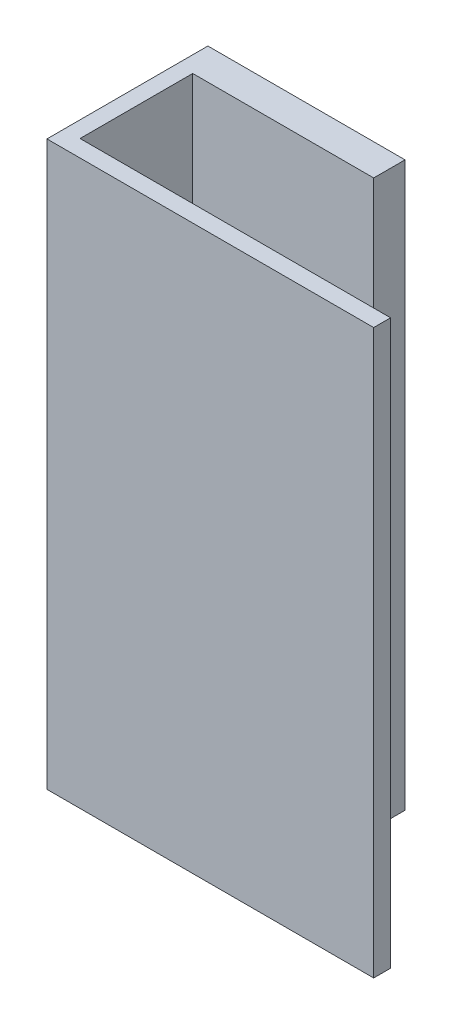
ISO-10303-21;
HEADER;
FILE_DESCRIPTION(('STEP AP214'),'2;1');
FILE_NAME('part.step','',(''),(''),'','','');
FILE_SCHEMA(('AUTOMOTIVE_DESIGN { 1 0 10303 214 1 1 1 1 }'));
ENDSEC;
DATA;
#1=APPLICATION_CONTEXT('core data for automotive mechanical design processes');
#2=APPLICATION_PROTOCOL_DEFINITION('international standard','automotive_design',2000,#1);
#3=PRODUCT_CONTEXT('',#1,'mechanical');
#4=PRODUCT('Part','Part','',(#3));
#5=PRODUCT_RELATED_PRODUCT_CATEGORY('part','',(#4));
#6=PRODUCT_DEFINITION_FORMATION('','',#4);
#7=PRODUCT_DEFINITION_CONTEXT('part definition',#1,'design');
#8=PRODUCT_DEFINITION('design','',#6,#7);
#9=PRODUCT_DEFINITION_SHAPE('','',#8);
#10=(LENGTH_UNIT() NAMED_UNIT(*) SI_UNIT(.MILLI.,.METRE.));
#11=(NAMED_UNIT(*) PLANE_ANGLE_UNIT() SI_UNIT($,.RADIAN.));
#12=(NAMED_UNIT(*) SI_UNIT($,.STERADIAN.) SOLID_ANGLE_UNIT());
#13=UNCERTAINTY_MEASURE_WITH_UNIT(LENGTH_MEASURE(1.E-05),#10,'distance_accuracy_value','');
#14=(GEOMETRIC_REPRESENTATION_CONTEXT(3) GLOBAL_UNCERTAINTY_ASSIGNED_CONTEXT((#13)) GLOBAL_UNIT_ASSIGNED_CONTEXT((#10,
#11,#12)) REPRESENTATION_CONTEXT('',''));
#15=CARTESIAN_POINT('',(0.,0.,0.));
#16=DIRECTION('',(0.,0.,1.));
#17=DIRECTION('',(1.,0.,0.));
#18=AXIS2_PLACEMENT_3D('',#15,#16,#17);
#19=CARTESIAN_POINT('',(0.,25.,0.));
#20=DIRECTION('',(0.,0.,-1.));
#21=DIRECTION('',(-1.,0.,0.));
#22=AXIS2_PLACEMENT_3D('',#19,#20,#21);
#23=PLANE('',#22);
#24=DIRECTION('',(0.,-1.,0.));
#25=VECTOR('',#24,1.);
#26=CARTESIAN_POINT('',(0.,25.,0.));
#27=LINE('',#26,#25);
#28=CARTESIAN_POINT('',(0.,145.,0.));
#29=VERTEX_POINT('',#28);
#30=CARTESIAN_POINT('',(0.,45.,0.));
#31=VERTEX_POINT('',#30);
#32=EDGE_CURVE('E11',#29,#31,#27,.T.);
#33=ORIENTED_EDGE('',*,*,#32,.T.);
#34=DIRECTION('',(1.,0.,0.));
#35=VECTOR('',#34,1.);
#36=CARTESIAN_POINT('',(0.,45.,0.));
#37=LINE('',#36,#35);
#38=CARTESIAN_POINT('',(58.,45.,0.));
#39=VERTEX_POINT('',#38);
#40=EDGE_CURVE('E125',#31,#39,#37,.T.);
#41=ORIENTED_EDGE('',*,*,#40,.T.);
#42=DIRECTION('',(0.,-1.,0.));
#43=VECTOR('',#42,1.);
#44=CARTESIAN_POINT('',(58.,145.,0.));
#45=LINE('',#44,#43);
#46=CARTESIAN_POINT('',(58.,145.,0.));
#47=VERTEX_POINT('',#46);
#48=EDGE_CURVE('E147',#47,#39,#45,.T.);
#49=ORIENTED_EDGE('',*,*,#48,.F.);
#50=DIRECTION('',(1.,0.,0.));
#51=VECTOR('',#50,1.);
#52=CARTESIAN_POINT('',(0.,145.,0.));
#53=LINE('',#52,#51);
#54=EDGE_CURVE('E161',#29,#47,#53,.T.);
#55=ORIENTED_EDGE('',*,*,#54,.F.);
#56=EDGE_LOOP('',(#33,#41,#49,#55));
#57=FACE_BOUND('',#56,.T.);
#58=ADVANCED_FACE('F43',(#57),#23,.F.);
#59=CARTESIAN_POINT('',(0.,25.,0.));
#60=DIRECTION('',(1.,0.,0.));
#61=DIRECTION('',(0.,0.,-1.));
#62=AXIS2_PLACEMENT_3D('',#59,#60,#61);
#63=PLANE('',#62);
#64=DIRECTION('',(0.,-1.,0.));
#65=VECTOR('',#64,1.);
#66=CARTESIAN_POINT('',(0.,145.,-28.5668374998999));
#67=LINE('',#66,#65);
#68=CARTESIAN_POINT('',(0.,145.,-28.5668374998999));
#69=VERTEX_POINT('',#68);
#70=CARTESIAN_POINT('',(0.,45.,-28.5668374998999));
#71=VERTEX_POINT('',#70);
#72=EDGE_CURVE('E59',#69,#71,#67,.T.);
#73=ORIENTED_EDGE('',*,*,#72,.T.);
#74=DIRECTION('',(0.,0.,1.));
#75=VECTOR('',#74,1.);
#76=CARTESIAN_POINT('',(0.,45.,0.));
#77=LINE('',#76,#75);
#78=EDGE_CURVE('E117',#71,#31,#77,.T.);
#79=ORIENTED_EDGE('',*,*,#78,.T.);
#80=ORIENTED_EDGE('',*,*,#32,.F.);
#81=DIRECTION('',(0.,0.,1.));
#82=VECTOR('',#81,1.);
#83=CARTESIAN_POINT('',(0.,145.,-28.5668374998999));
#84=LINE('',#83,#82);
#85=EDGE_CURVE('E119',#69,#29,#84,.T.);
#86=ORIENTED_EDGE('',*,*,#85,.F.);
#87=EDGE_LOOP('',(#73,#79,#80,#86));
#88=FACE_BOUND('',#87,.T.);
#89=ADVANCED_FACE('F45',(#88),#63,.F.);
#90=CARTESIAN_POINT('',(3.,45.,-3.));
#91=DIRECTION('',(0.,0.,-1.));
#92=DIRECTION('',(-1.,0.,0.));
#93=AXIS2_PLACEMENT_3D('',#90,#91,#92);
#94=PLANE('',#93);
#95=DIRECTION('',(0.,-1.,0.));
#96=VECTOR('',#95,1.);
#97=CARTESIAN_POINT('',(58.,145.,-3.));
#98=LINE('',#97,#96);
#99=CARTESIAN_POINT('',(58.,145.,-3.));
#100=VERTEX_POINT('',#99);
#101=CARTESIAN_POINT('',(58.,45.,-3.));
#102=VERTEX_POINT('',#101);
#103=EDGE_CURVE('E143',#100,#102,#98,.T.);
#104=ORIENTED_EDGE('',*,*,#103,.T.);
#105=DIRECTION('',(-1.,0.,0.));
#106=VECTOR('',#105,1.);
#107=CARTESIAN_POINT('',(58.,45.,-3.));
#108=LINE('',#107,#106);
#109=CARTESIAN_POINT('',(2.87608575347081,45.,-3.));
#110=VERTEX_POINT('',#109);
#111=EDGE_CURVE('E192',#102,#110,#108,.T.);
#112=ORIENTED_EDGE('',*,*,#111,.T.);
#113=DIRECTION('',(0.,-1.,0.));
#114=VECTOR('',#113,1.);
#115=CARTESIAN_POINT('',(2.87608575347081,145.,-3.));
#116=LINE('',#115,#114);
#117=CARTESIAN_POINT('',(2.87608575347081,145.,-3.));
#118=VERTEX_POINT('',#117);
#119=EDGE_CURVE('E136',#118,#110,#116,.T.);
#120=ORIENTED_EDGE('',*,*,#119,.F.);
#121=DIRECTION('',(-1.,0.,0.));
#122=VECTOR('',#121,1.);
#123=CARTESIAN_POINT('',(58.,145.,-3.));
#124=LINE('',#123,#122);
#125=EDGE_CURVE('E174',#100,#118,#124,.T.);
#126=ORIENTED_EDGE('',*,*,#125,.F.);
#127=EDGE_LOOP('',(#104,#112,#120,#126));
#128=FACE_BOUND('',#127,.T.);
#129=ADVANCED_FACE('F207',(#128),#94,.T.);
#130=CARTESIAN_POINT('',(32.,45.,-23.));
#131=DIRECTION('',(0.,0.,-1.));
#132=DIRECTION('',(-1.,0.,0.));
#133=AXIS2_PLACEMENT_3D('',#130,#131,#132);
#134=PLANE('',#133);
#135=DIRECTION('',(1.,0.,0.));
#136=VECTOR('',#135,1.);
#137=CARTESIAN_POINT('',(2.87608575347081,45.,-23.));
#138=LINE('',#137,#136);
#139=CARTESIAN_POINT('',(2.87608575347081,45.,-23.));
#140=VERTEX_POINT('',#139);
#141=CARTESIAN_POINT('',(35.,45.,-23.));
#142=VERTEX_POINT('',#141);
#143=EDGE_CURVE('E120',#140,#142,#138,.T.);
#144=ORIENTED_EDGE('',*,*,#143,.T.);
#145=DIRECTION('',(0.,-1.,0.));
#146=VECTOR('',#145,1.);
#147=CARTESIAN_POINT('',(35.,45.,-23.));
#148=LINE('',#147,#146);
#149=CARTESIAN_POINT('',(35.,145.,-23.));
#150=VERTEX_POINT('',#149);
#151=EDGE_CURVE('E52',#150,#142,#148,.T.);
#152=ORIENTED_EDGE('',*,*,#151,.F.);
#153=DIRECTION('',(1.,0.,0.));
#154=VECTOR('',#153,1.);
#155=CARTESIAN_POINT('',(2.87608575347081,145.,-23.));
#156=LINE('',#155,#154);
#157=CARTESIAN_POINT('',(2.87608575347081,145.,-23.));
#158=VERTEX_POINT('',#157);
#159=EDGE_CURVE('E181',#158,#150,#156,.T.);
#160=ORIENTED_EDGE('',*,*,#159,.F.);
#161=DIRECTION('',(0.,-1.,0.));
#162=VECTOR('',#161,1.);
#163=CARTESIAN_POINT('',(2.87608575347081,145.,-23.));
#164=LINE('',#163,#162);
#165=EDGE_CURVE('E131',#158,#140,#164,.T.);
#166=ORIENTED_EDGE('',*,*,#165,.T.);
#167=EDGE_LOOP('',(#144,#152,#160,#166));
#168=FACE_BOUND('',#167,.T.);
#169=ADVANCED_FACE('F201',(#168),#134,.F.);
#170=CARTESIAN_POINT('',(35.,45.,-23.));
#171=DIRECTION('',(-1.,0.,0.));
#172=DIRECTION('',(0.,0.,1.));
#173=AXIS2_PLACEMENT_3D('',#170,#171,#172);
#174=PLANE('',#173);
#175=ORIENTED_EDGE('',*,*,#151,.T.);
#176=DIRECTION('',(0.,0.,-1.));
#177=VECTOR('',#176,1.);
#178=CARTESIAN_POINT('',(35.,45.,-23.));
#179=LINE('',#178,#177);
#180=CARTESIAN_POINT('',(35.,45.,-28.5668374998999));
#181=VERTEX_POINT('',#180);
#182=EDGE_CURVE('E114',#142,#181,#179,.T.);
#183=ORIENTED_EDGE('',*,*,#182,.T.);
#184=DIRECTION('',(0.,-1.,0.));
#185=VECTOR('',#184,1.);
#186=CARTESIAN_POINT('',(35.,145.,-28.5668374998999));
#187=LINE('',#186,#185);
#188=CARTESIAN_POINT('',(35.,145.,-28.5668374998999));
#189=VERTEX_POINT('',#188);
#190=EDGE_CURVE('E67',#189,#181,#187,.T.);
#191=ORIENTED_EDGE('',*,*,#190,.F.);
#192=DIRECTION('',(0.,0.,1.));
#193=VECTOR('',#192,1.);
#194=CARTESIAN_POINT('',(35.,145.,-28.5668374998999));
#195=LINE('',#194,#193);
#196=EDGE_CURVE('E185',#189,#150,#195,.T.);
#197=ORIENTED_EDGE('',*,*,#196,.T.);
#198=EDGE_LOOP('',(#175,#183,#191,#197));
#199=FACE_BOUND('',#198,.T.);
#200=ADVANCED_FACE('F122',(#199),#174,.F.);
#201=CARTESIAN_POINT('',(0.,45.,0.));
#202=DIRECTION('',(0.,1.,0.));
#203=DIRECTION('',(0.,0.,1.));
#204=AXIS2_PLACEMENT_3D('',#201,#202,#203);
#205=PLANE('',#204);
#206=ORIENTED_EDGE('',*,*,#182,.F.);
#207=ORIENTED_EDGE('',*,*,#143,.F.);
#208=DIRECTION('',(0.,0.,1.));
#209=VECTOR('',#208,1.);
#210=CARTESIAN_POINT('',(2.87608575347081,45.,-23.));
#211=LINE('',#210,#209);
#212=EDGE_CURVE('E196',#140,#110,#211,.T.);
#213=ORIENTED_EDGE('',*,*,#212,.T.);
#214=ORIENTED_EDGE('',*,*,#111,.F.);
#215=DIRECTION('',(0.,0.,1.));
#216=VECTOR('',#215,1.);
#217=CARTESIAN_POINT('',(58.,45.,-3.));
#218=LINE('',#217,#216);
#219=EDGE_CURVE('E124',#102,#39,#218,.T.);
#220=ORIENTED_EDGE('',*,*,#219,.T.);
#221=ORIENTED_EDGE('',*,*,#40,.F.);
#222=ORIENTED_EDGE('',*,*,#78,.F.);
#223=DIRECTION('',(1.,0.,0.));
#224=VECTOR('',#223,1.);
#225=CARTESIAN_POINT('',(0.,45.,-28.5668374998999));
#226=LINE('',#225,#224);
#227=EDGE_CURVE('E112',#71,#181,#226,.T.);
#228=ORIENTED_EDGE('',*,*,#227,.T.);
#229=EDGE_LOOP('',(#206,#207,#213,#214,#220,#221,#222,#228));
#230=FACE_BOUND('',#229,.T.);
#231=ADVANCED_FACE('F113',(#230),#205,.F.);
#232=CARTESIAN_POINT('',(58.,145.,-3.));
#233=DIRECTION('',(1.,0.,0.));
#234=DIRECTION('',(0.,0.,-1.));
#235=AXIS2_PLACEMENT_3D('',#232,#233,#234);
#236=PLANE('',#235);
#237=ORIENTED_EDGE('',*,*,#219,.F.);
#238=ORIENTED_EDGE('',*,*,#103,.F.);
#239=DIRECTION('',(0.,0.,1.));
#240=VECTOR('',#239,1.);
#241=CARTESIAN_POINT('',(58.,145.,-3.));
#242=LINE('',#241,#240);
#243=EDGE_CURVE('E157',#100,#47,#242,.T.);
#244=ORIENTED_EDGE('',*,*,#243,.T.);
#245=ORIENTED_EDGE('',*,*,#48,.T.);
#246=EDGE_LOOP('',(#237,#238,#244,#245));
#247=FACE_BOUND('',#246,.T.);
#248=ADVANCED_FACE('F155',(#247),#236,.T.);
#249=CARTESIAN_POINT('',(2.87608575347081,145.,-23.));
#250=DIRECTION('',(1.,0.,0.));
#251=DIRECTION('',(0.,0.,-1.));
#252=AXIS2_PLACEMENT_3D('',#249,#250,#251);
#253=PLANE('',#252);
#254=ORIENTED_EDGE('',*,*,#212,.F.);
#255=ORIENTED_EDGE('',*,*,#165,.F.);
#256=DIRECTION('',(0.,0.,1.));
#257=VECTOR('',#256,1.);
#258=CARTESIAN_POINT('',(2.87608575347081,145.,-23.));
#259=LINE('',#258,#257);
#260=EDGE_CURVE('E177',#158,#118,#259,.T.);
#261=ORIENTED_EDGE('',*,*,#260,.T.);
#262=ORIENTED_EDGE('',*,*,#119,.T.);
#263=EDGE_LOOP('',(#254,#255,#261,#262));
#264=FACE_BOUND('',#263,.T.);
#265=ADVANCED_FACE('F209',(#264),#253,.T.);
#266=CARTESIAN_POINT('',(0.,145.,-28.5668374998999));
#267=DIRECTION('',(0.,0.,-1.));
#268=DIRECTION('',(-1.,0.,0.));
#269=AXIS2_PLACEMENT_3D('',#266,#267,#268);
#270=PLANE('',#269);
#271=ORIENTED_EDGE('',*,*,#227,.F.);
#272=ORIENTED_EDGE('',*,*,#72,.F.);
#273=DIRECTION('',(1.,0.,0.));
#274=VECTOR('',#273,1.);
#275=CARTESIAN_POINT('',(0.,145.,-28.5668374998999));
#276=LINE('',#275,#274);
#277=EDGE_CURVE('E129',#69,#189,#276,.T.);
#278=ORIENTED_EDGE('',*,*,#277,.T.);
#279=ORIENTED_EDGE('',*,*,#190,.T.);
#280=EDGE_LOOP('',(#271,#272,#278,#279));
#281=FACE_BOUND('',#280,.T.);
#282=ADVANCED_FACE('F127',(#281),#270,.T.);
#283=CARTESIAN_POINT('',(0.,145.,0.));
#284=DIRECTION('',(0.,1.,0.));
#285=DIRECTION('',(0.,0.,1.));
#286=AXIS2_PLACEMENT_3D('',#283,#284,#285);
#287=PLANE('',#286);
#288=ORIENTED_EDGE('',*,*,#85,.T.);
#289=ORIENTED_EDGE('',*,*,#54,.T.);
#290=ORIENTED_EDGE('',*,*,#243,.F.);
#291=ORIENTED_EDGE('',*,*,#125,.T.);
#292=ORIENTED_EDGE('',*,*,#260,.F.);
#293=ORIENTED_EDGE('',*,*,#159,.T.);
#294=ORIENTED_EDGE('',*,*,#196,.F.);
#295=ORIENTED_EDGE('',*,*,#277,.F.);
#296=EDGE_LOOP('',(#288,#289,#290,#291,#292,#293,#294,#295));
#297=FACE_BOUND('',#296,.T.);
#298=ADVANCED_FACE('F212',(#297),#287,.T.);
#299=CLOSED_SHELL('',(#58,#89,#129,#169,#200,#231,#248,#265,#282,#298));
#300=MANIFOLD_SOLID_BREP('B2',#299);
#301=ADVANCED_BREP_SHAPE_REPRESENTATION('',(#18,#300),#14);
#302=SHAPE_DEFINITION_REPRESENTATION(#9,#301);
ENDSEC;
END-ISO-10303-21;
